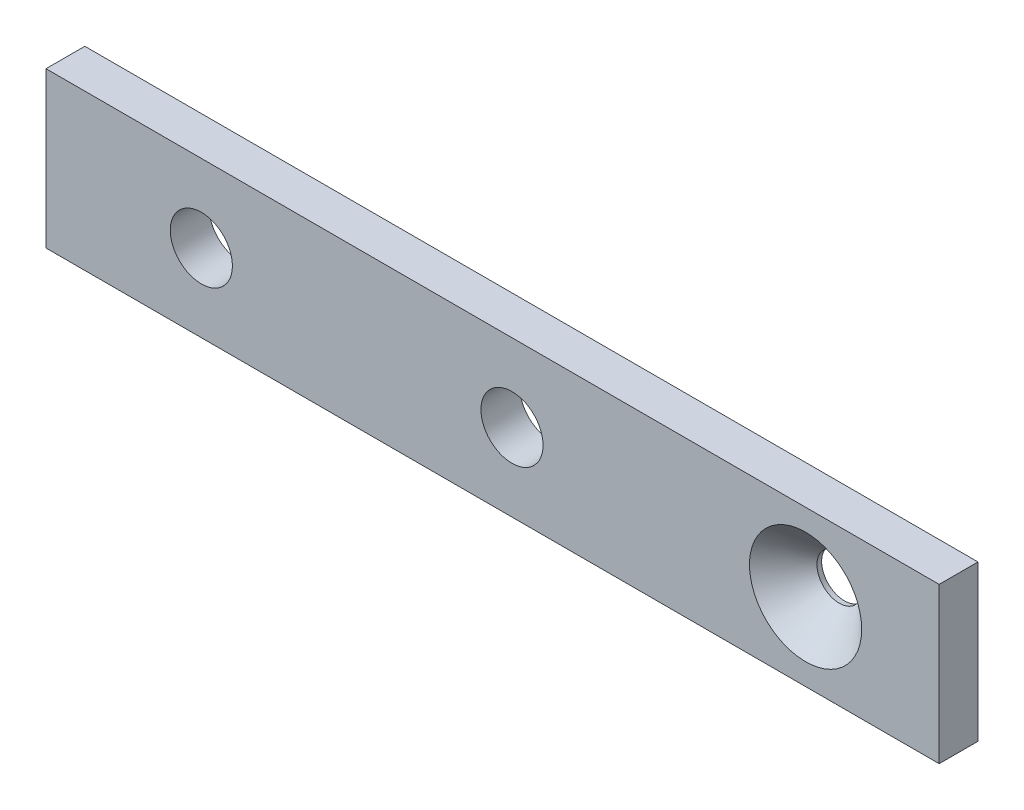
ISO-10303-21;
HEADER;
FILE_DESCRIPTION(('STEP AP214'),'2;1');
FILE_NAME('part.step','',(''),(''),'','','');
FILE_SCHEMA(('AUTOMOTIVE_DESIGN { 1 0 10303 214 1 1 1 1 }'));
ENDSEC;
DATA;
#1=APPLICATION_CONTEXT('core data for automotive mechanical design processes');
#2=APPLICATION_PROTOCOL_DEFINITION('international standard','automotive_design',2000,#1);
#3=PRODUCT_CONTEXT('',#1,'mechanical');
#4=PRODUCT('Part','Part','',(#3));
#5=PRODUCT_RELATED_PRODUCT_CATEGORY('part','',(#4));
#6=PRODUCT_DEFINITION_FORMATION('','',#4);
#7=PRODUCT_DEFINITION_CONTEXT('part definition',#1,'design');
#8=PRODUCT_DEFINITION('design','',#6,#7);
#9=PRODUCT_DEFINITION_SHAPE('','',#8);
#10=(LENGTH_UNIT() NAMED_UNIT(*) SI_UNIT(.MILLI.,.METRE.));
#11=(NAMED_UNIT(*) PLANE_ANGLE_UNIT() SI_UNIT($,.RADIAN.));
#12=(NAMED_UNIT(*) SI_UNIT($,.STERADIAN.) SOLID_ANGLE_UNIT());
#13=UNCERTAINTY_MEASURE_WITH_UNIT(LENGTH_MEASURE(1.E-05),#10,'distance_accuracy_value','');
#14=(GEOMETRIC_REPRESENTATION_CONTEXT(3) GLOBAL_UNCERTAINTY_ASSIGNED_CONTEXT((#13)) GLOBAL_UNIT_ASSIGNED_CONTEXT((#10,
#11,#12)) REPRESENTATION_CONTEXT('',''));
#15=CARTESIAN_POINT('',(0.,0.,0.));
#16=DIRECTION('',(0.,0.,1.));
#17=DIRECTION('',(1.,0.,0.));
#18=AXIS2_PLACEMENT_3D('',#15,#16,#17);
#19=CARTESIAN_POINT('',(47.625,0.,3.175));
#20=DIRECTION('',(1.,0.,0.));
#21=DIRECTION('',(0.,0.,-1.));
#22=AXIS2_PLACEMENT_3D('',#19,#20,#21);
#23=PLANE('',#22);
#24=DIRECTION('',(0.,-1.,0.));
#25=VECTOR('',#24,1.);
#26=CARTESIAN_POINT('',(47.625,0.,0.));
#27=LINE('',#26,#25);
#28=CARTESIAN_POINT('',(47.625,6.35,0.));
#29=VERTEX_POINT('',#28);
#30=CARTESIAN_POINT('',(47.625,-6.34999999999999,0.));
#31=VERTEX_POINT('',#30);
#32=EDGE_CURVE('E132',#29,#31,#27,.T.);
#33=ORIENTED_EDGE('',*,*,#32,.F.);
#34=DIRECTION('',(0.,0.,-1.));
#35=VECTOR('',#34,1.);
#36=CARTESIAN_POINT('',(47.625,6.35,3.175));
#37=LINE('',#36,#35);
#38=CARTESIAN_POINT('',(47.625,6.35,3.175));
#39=VERTEX_POINT('',#38);
#40=EDGE_CURVE('E94',#39,#29,#37,.T.);
#41=ORIENTED_EDGE('',*,*,#40,.F.);
#42=DIRECTION('',(0.,-1.,0.));
#43=VECTOR('',#42,1.);
#44=CARTESIAN_POINT('',(47.625,0.,3.175));
#45=LINE('',#44,#43);
#46=CARTESIAN_POINT('',(47.625,-6.34999999999999,3.175));
#47=VERTEX_POINT('',#46);
#48=EDGE_CURVE('E113',#39,#47,#45,.T.);
#49=ORIENTED_EDGE('',*,*,#48,.T.);
#50=DIRECTION('',(0.,0.,-1.));
#51=VECTOR('',#50,1.);
#52=CARTESIAN_POINT('',(47.625,-6.34999999999999,3.175));
#53=LINE('',#52,#51);
#54=EDGE_CURVE('E91',#47,#31,#53,.T.);
#55=ORIENTED_EDGE('',*,*,#54,.T.);
#56=EDGE_LOOP('',(#33,#41,#49,#55));
#57=FACE_BOUND('',#56,.T.);
#58=ADVANCED_FACE('F49',(#57),#23,.T.);
#59=CARTESIAN_POINT('',(0.,6.35,3.175));
#60=DIRECTION('',(0.,1.,0.));
#61=DIRECTION('',(0.,0.,1.));
#62=AXIS2_PLACEMENT_3D('',#59,#60,#61);
#63=PLANE('',#62);
#64=DIRECTION('',(1.,0.,0.));
#65=VECTOR('',#64,1.);
#66=CARTESIAN_POINT('',(0.,6.35,0.));
#67=LINE('',#66,#65);
#68=CARTESIAN_POINT('',(-25.4,6.35,0.));
#69=VERTEX_POINT('',#68);
#70=EDGE_CURVE('E104',#69,#29,#67,.T.);
#71=ORIENTED_EDGE('',*,*,#70,.F.);
#72=DIRECTION('',(0.,0.,-1.));
#73=VECTOR('',#72,1.);
#74=CARTESIAN_POINT('',(-25.4,6.35,3.175));
#75=LINE('',#74,#73);
#76=CARTESIAN_POINT('',(-25.4,6.35,3.175));
#77=VERTEX_POINT('',#76);
#78=EDGE_CURVE('E99',#77,#69,#75,.T.);
#79=ORIENTED_EDGE('',*,*,#78,.F.);
#80=DIRECTION('',(1.,0.,0.));
#81=VECTOR('',#80,1.);
#82=CARTESIAN_POINT('',(0.,6.35,3.175));
#83=LINE('',#82,#81);
#84=EDGE_CURVE('E102',#77,#39,#83,.T.);
#85=ORIENTED_EDGE('',*,*,#84,.T.);
#86=ORIENTED_EDGE('',*,*,#40,.T.);
#87=EDGE_LOOP('',(#71,#79,#85,#86));
#88=FACE_BOUND('',#87,.T.);
#89=ADVANCED_FACE('F101',(#88),#63,.T.);
#90=CARTESIAN_POINT('',(-25.4,0.,3.175));
#91=DIRECTION('',(-1.,0.,0.));
#92=DIRECTION('',(0.,0.,1.));
#93=AXIS2_PLACEMENT_3D('',#90,#91,#92);
#94=PLANE('',#93);
#95=DIRECTION('',(0.,1.,0.));
#96=VECTOR('',#95,1.);
#97=CARTESIAN_POINT('',(-25.4,0.,0.));
#98=LINE('',#97,#96);
#99=CARTESIAN_POINT('',(-25.4,-6.35,0.));
#100=VERTEX_POINT('',#99);
#101=EDGE_CURVE('E138',#100,#69,#98,.T.);
#102=ORIENTED_EDGE('',*,*,#101,.F.);
#103=DIRECTION('',(0.,0.,-1.));
#104=VECTOR('',#103,1.);
#105=CARTESIAN_POINT('',(-25.4,-6.35,3.175));
#106=LINE('',#105,#104);
#107=CARTESIAN_POINT('',(-25.4,-6.35,3.175));
#108=VERTEX_POINT('',#107);
#109=EDGE_CURVE('E84',#108,#100,#106,.T.);
#110=ORIENTED_EDGE('',*,*,#109,.F.);
#111=DIRECTION('',(0.,1.,0.));
#112=VECTOR('',#111,1.);
#113=CARTESIAN_POINT('',(-25.4,0.,3.175));
#114=LINE('',#113,#112);
#115=EDGE_CURVE('E112',#108,#77,#114,.T.);
#116=ORIENTED_EDGE('',*,*,#115,.T.);
#117=ORIENTED_EDGE('',*,*,#78,.T.);
#118=EDGE_LOOP('',(#102,#110,#116,#117));
#119=FACE_BOUND('',#118,.T.);
#120=ADVANCED_FACE('F116',(#119),#94,.T.);
#121=CARTESIAN_POINT('',(-12.7,0.,3.175));
#122=DIRECTION('',(0.,0.,-1.));
#123=DIRECTION('',(-1.,0.,0.));
#124=AXIS2_PLACEMENT_3D('',#121,#122,#123);
#125=CYLINDRICAL_SURFACE('',#124,2.54);
#126=CARTESIAN_POINT('',(-12.7,0.,3.175));
#127=DIRECTION('',(0.,0.,1.));
#128=DIRECTION('',(1.,0.,0.));
#129=AXIS2_PLACEMENT_3D('',#126,#127,#128);
#130=CIRCLE('',#129,2.54);
#131=CARTESIAN_POINT('',(-10.16,0.,3.175));
#132=VERTEX_POINT('',#131);
#133=EDGE_CURVE('E196',#132,#132,#130,.T.);
#134=ORIENTED_EDGE('',*,*,#133,.T.);
#135=EDGE_LOOP('',(#134));
#136=FACE_BOUND('',#135,.T.);
#137=CARTESIAN_POINT('',(-12.7,0.,0.));
#138=DIRECTION('',(0.,0.,1.));
#139=DIRECTION('',(1.,0.,0.));
#140=AXIS2_PLACEMENT_3D('',#137,#138,#139);
#141=CIRCLE('',#140,2.54);
#142=CARTESIAN_POINT('',(-10.16,0.,0.));
#143=VERTEX_POINT('',#142);
#144=EDGE_CURVE('E127',#143,#143,#141,.T.);
#145=ORIENTED_EDGE('',*,*,#144,.F.);
#146=EDGE_LOOP('',(#145));
#147=FACE_BOUND('',#146,.T.);
#148=ADVANCED_FACE('F173',(#136,#147),#125,.F.);
#149=CARTESIAN_POINT('',(12.7,0.,3.175));
#150=DIRECTION('',(0.,0.,-1.));
#151=DIRECTION('',(-1.,0.,0.));
#152=AXIS2_PLACEMENT_3D('',#149,#150,#151);
#153=CYLINDRICAL_SURFACE('',#152,2.54);
#154=CARTESIAN_POINT('',(12.7,0.,3.175));
#155=DIRECTION('',(0.,0.,1.));
#156=DIRECTION('',(1.,0.,0.));
#157=AXIS2_PLACEMENT_3D('',#154,#155,#156);
#158=CIRCLE('',#157,2.54);
#159=CARTESIAN_POINT('',(15.24,0.,3.175));
#160=VERTEX_POINT('',#159);
#161=EDGE_CURVE('E144',#160,#160,#158,.T.);
#162=ORIENTED_EDGE('',*,*,#161,.T.);
#163=EDGE_LOOP('',(#162));
#164=FACE_BOUND('',#163,.T.);
#165=CARTESIAN_POINT('',(12.7,0.,0.));
#166=DIRECTION('',(0.,0.,1.));
#167=DIRECTION('',(1.,0.,0.));
#168=AXIS2_PLACEMENT_3D('',#165,#166,#167);
#169=CIRCLE('',#168,2.54);
#170=CARTESIAN_POINT('',(15.24,0.,0.));
#171=VERTEX_POINT('',#170);
#172=EDGE_CURVE('E123',#171,#171,#169,.T.);
#173=ORIENTED_EDGE('',*,*,#172,.F.);
#174=EDGE_LOOP('',(#173));
#175=FACE_BOUND('',#174,.T.);
#176=ADVANCED_FACE('F175',(#164,#175),#153,.F.);
#177=CARTESIAN_POINT('',(0.,-6.35,3.175));
#178=DIRECTION('',(0.,1.,0.));
#179=DIRECTION('',(0.,0.,1.));
#180=AXIS2_PLACEMENT_3D('',#177,#178,#179);
#181=PLANE('',#180);
#182=DIRECTION('',(1.,0.,0.));
#183=VECTOR('',#182,1.);
#184=CARTESIAN_POINT('',(0.,-6.35,0.));
#185=LINE('',#184,#183);
#186=EDGE_CURVE('E141',#100,#31,#185,.T.);
#187=ORIENTED_EDGE('',*,*,#186,.T.);
#188=ORIENTED_EDGE('',*,*,#54,.F.);
#189=DIRECTION('',(1.,0.,0.));
#190=VECTOR('',#189,1.);
#191=CARTESIAN_POINT('',(0.,-6.35,3.175));
#192=LINE('',#191,#190);
#193=EDGE_CURVE('E68',#108,#47,#192,.T.);
#194=ORIENTED_EDGE('',*,*,#193,.F.);
#195=ORIENTED_EDGE('',*,*,#109,.T.);
#196=EDGE_LOOP('',(#187,#188,#194,#195));
#197=FACE_BOUND('',#196,.T.);
#198=ADVANCED_FACE('F178',(#197),#181,.F.);
#199=CARTESIAN_POINT('',(0.,0.,3.175));
#200=DIRECTION('',(0.,0.,1.));
#201=DIRECTION('',(1.,0.,0.));
#202=AXIS2_PLACEMENT_3D('',#199,#200,#201);
#203=PLANE('',#202);
#204=CARTESIAN_POINT('',(36.703,0.,3.175));
#205=DIRECTION('',(0.,0.,1.));
#206=DIRECTION('',(1.,0.,0.));
#207=AXIS2_PLACEMENT_3D('',#204,#205,#206);
#208=CIRCLE('',#207,4.58750000000001);
#209=CARTESIAN_POINT('',(41.2905,0.,3.175));
#210=VERTEX_POINT('',#209);
#211=EDGE_CURVE('E11',#210,#210,#208,.F.);
#212=ORIENTED_EDGE('',*,*,#211,.T.);
#213=EDGE_LOOP('',(#212));
#214=FACE_BOUND('',#213,.T.);
#215=ORIENTED_EDGE('',*,*,#161,.F.);
#216=EDGE_LOOP('',(#215));
#217=FACE_BOUND('',#216,.T.);
#218=ORIENTED_EDGE('',*,*,#133,.F.);
#219=EDGE_LOOP('',(#218));
#220=FACE_BOUND('',#219,.T.);
#221=ORIENTED_EDGE('',*,*,#48,.F.);
#222=ORIENTED_EDGE('',*,*,#84,.F.);
#223=ORIENTED_EDGE('',*,*,#115,.F.);
#224=ORIENTED_EDGE('',*,*,#193,.T.);
#225=EDGE_LOOP('',(#221,#222,#223,#224));
#226=FACE_BOUND('',#225,.T.);
#227=ADVANCED_FACE('F111',(#214,#217,#220,#226),#203,.T.);
#228=CARTESIAN_POINT('',(0.,0.,0.));
#229=DIRECTION('',(0.,0.,1.));
#230=DIRECTION('',(1.,0.,0.));
#231=AXIS2_PLACEMENT_3D('',#228,#229,#230);
#232=PLANE('',#231);
#233=CARTESIAN_POINT('',(36.703,0.,0.));
#234=DIRECTION('',(0.,0.,1.));
#235=DIRECTION('',(1.,0.,0.));
#236=AXIS2_PLACEMENT_3D('',#233,#234,#235);
#237=CIRCLE('',#236,1.86527650669481);
#238=CARTESIAN_POINT('',(38.5682765066948,0.,0.));
#239=VERTEX_POINT('',#238);
#240=EDGE_CURVE('E128',#239,#239,#237,.T.);
#241=ORIENTED_EDGE('',*,*,#240,.T.);
#242=EDGE_LOOP('',(#241));
#243=FACE_BOUND('',#242,.T.);
#244=ORIENTED_EDGE('',*,*,#172,.T.);
#245=EDGE_LOOP('',(#244));
#246=FACE_BOUND('',#245,.T.);
#247=ORIENTED_EDGE('',*,*,#144,.T.);
#248=EDGE_LOOP('',(#247));
#249=FACE_BOUND('',#248,.T.);
#250=ORIENTED_EDGE('',*,*,#32,.T.);
#251=ORIENTED_EDGE('',*,*,#186,.F.);
#252=ORIENTED_EDGE('',*,*,#101,.T.);
#253=ORIENTED_EDGE('',*,*,#70,.T.);
#254=EDGE_LOOP('',(#250,#251,#252,#253));
#255=FACE_BOUND('',#254,.T.);
#256=ADVANCED_FACE('F162',(#243,#246,#249,#255),#232,.F.);
#257=CARTESIAN_POINT('',(36.703,0.,3.175));
#258=DIRECTION('',(0.,0.,-1.));
#259=DIRECTION('',(1.,0.,0.));
#260=AXIS2_PLACEMENT_3D('',#257,#258,#259);
#261=CONICAL_SURFACE('',#260,1.5875,0.0872664625997167);
#262=CARTESIAN_POINT('',(36.703,0.,0.416350553234081));
#263=DIRECTION('',(0.,0.,-1.));
#264=DIRECTION('',(-1.,0.,0.));
#265=AXIS2_PLACEMENT_3D('',#262,#263,#264);
#266=CIRCLE('',#265,1.82885055323408);
#267=CARTESIAN_POINT('',(34.8741494467659,0.,0.416350553234081));
#268=VERTEX_POINT('',#267);
#269=EDGE_CURVE('E60',#268,#268,#266,.F.);
#270=ORIENTED_EDGE('',*,*,#269,.T.);
#271=EDGE_LOOP('',(#270));
#272=FACE_BOUND('',#271,.T.);
#273=ORIENTED_EDGE('',*,*,#240,.F.);
#274=EDGE_LOOP('',(#273));
#275=FACE_BOUND('',#274,.T.);
#276=ADVANCED_FACE('F154',(#272,#275),#261,.F.);
#277=CARTESIAN_POINT('',(36.703,0.,0.41635055323408));
#278=DIRECTION('',(0.,0.,1.));
#279=DIRECTION('',(1.,0.,0.));
#280=AXIS2_PLACEMENT_3D('',#277,#278,#279);
#281=CONICAL_SURFACE('',#280,1.82885055323408,0.78539816339745);
#282=ORIENTED_EDGE('',*,*,#211,.F.);
#283=EDGE_LOOP('',(#282));
#284=FACE_BOUND('',#283,.T.);
#285=ORIENTED_EDGE('',*,*,#269,.F.);
#286=EDGE_LOOP('',(#285));
#287=FACE_BOUND('',#286,.T.);
#288=ADVANCED_FACE('F52',(#284,#287),#281,.F.);
#289=CLOSED_SHELL('',(#58,#89,#120,#148,#176,#198,#227,#256,#276,#288));
#290=MANIFOLD_SOLID_BREP('B2',#289);
#291=ADVANCED_BREP_SHAPE_REPRESENTATION('',(#18,#290),#14);
#292=SHAPE_DEFINITION_REPRESENTATION(#9,#291);
ENDSEC;
END-ISO-10303-21;
